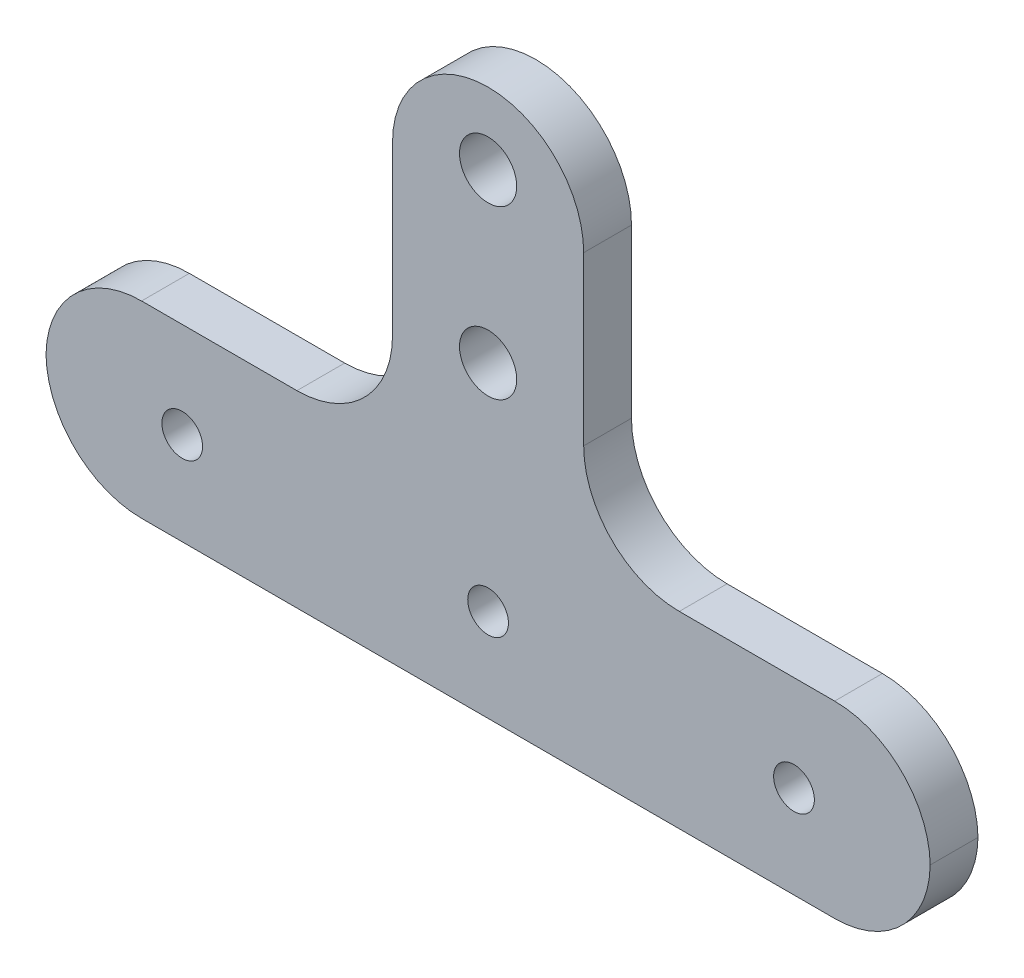
ISO-10303-21;
HEADER;
FILE_DESCRIPTION(('STEP AP214'),'2;1');
FILE_NAME('part.step','',(''),(''),'','','');
FILE_SCHEMA(('AUTOMOTIVE_DESIGN { 1 0 10303 214 1 1 1 1 }'));
ENDSEC;
DATA;
#1=APPLICATION_CONTEXT('core data for automotive mechanical design processes');
#2=APPLICATION_PROTOCOL_DEFINITION('international standard','automotive_design',2000,#1);
#3=PRODUCT_CONTEXT('',#1,'mechanical');
#4=PRODUCT('Part','Part','',(#3));
#5=PRODUCT_RELATED_PRODUCT_CATEGORY('part','',(#4));
#6=PRODUCT_DEFINITION_FORMATION('','',#4);
#7=PRODUCT_DEFINITION_CONTEXT('part definition',#1,'design');
#8=PRODUCT_DEFINITION('design','',#6,#7);
#9=PRODUCT_DEFINITION_SHAPE('','',#8);
#10=(LENGTH_UNIT() NAMED_UNIT(*) SI_UNIT(.MILLI.,.METRE.));
#11=(NAMED_UNIT(*) PLANE_ANGLE_UNIT() SI_UNIT($,.RADIAN.));
#12=(NAMED_UNIT(*) SI_UNIT($,.STERADIAN.) SOLID_ANGLE_UNIT());
#13=UNCERTAINTY_MEASURE_WITH_UNIT(LENGTH_MEASURE(1.E-05),#10,'distance_accuracy_value','');
#14=(GEOMETRIC_REPRESENTATION_CONTEXT(3) GLOBAL_UNCERTAINTY_ASSIGNED_CONTEXT((#13)) GLOBAL_UNIT_ASSIGNED_CONTEXT((#10,
#11,#12)) REPRESENTATION_CONTEXT('',''));
#15=CARTESIAN_POINT('',(0.,0.,0.));
#16=DIRECTION('',(0.,0.,1.));
#17=DIRECTION('',(1.,0.,0.));
#18=AXIS2_PLACEMENT_3D('',#15,#16,#17);
#19=CARTESIAN_POINT('',(0.,100.140279828564,3.175));
#20=DIRECTION('',(0.,1.,0.));
#21=DIRECTION('',(0.,0.,1.));
#22=AXIS2_PLACEMENT_3D('',#19,#20,#21);
#23=PLANE('',#22);
#24=DIRECTION('',(1.,0.,0.));
#25=VECTOR('',#24,1.);
#26=CARTESIAN_POINT('',(0.,100.140279828564,0.));
#27=LINE('',#26,#25);
#28=CARTESIAN_POINT('',(12.7,100.140279828564,0.));
#29=VERTEX_POINT('',#28);
#30=CARTESIAN_POINT('',(23.01875,100.140279828564,0.));
#31=VERTEX_POINT('',#30);
#32=EDGE_CURVE('E166',#29,#31,#27,.T.);
#33=ORIENTED_EDGE('',*,*,#32,.F.);
#34=DIRECTION('',(0.,0.,-1.));
#35=VECTOR('',#34,1.);
#36=CARTESIAN_POINT('',(12.7,100.140279828564,3.175));
#37=LINE('',#36,#35);
#38=CARTESIAN_POINT('',(12.7,100.140279828564,3.175));
#39=VERTEX_POINT('',#38);
#40=EDGE_CURVE('E178',#29,#39,#37,.F.);
#41=ORIENTED_EDGE('',*,*,#40,.T.);
#42=DIRECTION('',(1.,0.,0.));
#43=VECTOR('',#42,1.);
#44=CARTESIAN_POINT('',(0.,100.140279828564,3.175));
#45=LINE('',#44,#43);
#46=CARTESIAN_POINT('',(23.01875,100.140279828564,3.175));
#47=VERTEX_POINT('',#46);
#48=EDGE_CURVE('E151',#39,#47,#45,.T.);
#49=ORIENTED_EDGE('',*,*,#48,.T.);
#50=DIRECTION('',(0.,0.,-1.));
#51=VECTOR('',#50,1.);
#52=CARTESIAN_POINT('',(23.01875,100.140279828564,3.175));
#53=LINE('',#52,#51);
#54=EDGE_CURVE('E176',#47,#31,#53,.T.);
#55=ORIENTED_EDGE('',*,*,#54,.T.);
#56=EDGE_LOOP('',(#33,#41,#49,#55));
#57=FACE_BOUND('',#56,.T.);
#58=ADVANCED_FACE('F36',(#57),#23,.T.);
#59=CARTESIAN_POINT('',(6.3500000000001,-231.141421356237,3.175));
#60=DIRECTION('',(1.,0.,0.));
#61=DIRECTION('',(0.,1.,0.));
#62=AXIS2_PLACEMENT_3D('',#59,#60,#61);
#63=PLANE('',#62);
#64=DIRECTION('',(0.,-1.,0.));
#65=VECTOR('',#64,1.);
#66=CARTESIAN_POINT('',(6.3500000000001,-231.141421356237,3.175));
#67=LINE('',#66,#65);
#68=CARTESIAN_POINT('',(6.35,117.602779828564,3.175));
#69=VERTEX_POINT('',#68);
#70=CARTESIAN_POINT('',(6.35,106.490279828564,3.175));
#71=VERTEX_POINT('',#70);
#72=EDGE_CURVE('E130',#69,#71,#67,.T.);
#73=ORIENTED_EDGE('',*,*,#72,.T.);
#74=DIRECTION('',(0.,0.,-1.));
#75=VECTOR('',#74,1.);
#76=CARTESIAN_POINT('',(6.35,106.490279828564,0.));
#77=LINE('',#76,#75);
#78=CARTESIAN_POINT('',(6.35,106.490279828564,0.));
#79=VERTEX_POINT('',#78);
#80=EDGE_CURVE('E136',#71,#79,#77,.T.);
#81=ORIENTED_EDGE('',*,*,#80,.T.);
#82=DIRECTION('',(0.,-1.,0.));
#83=VECTOR('',#82,1.);
#84=CARTESIAN_POINT('',(6.3500000000001,-231.141421356237,0.));
#85=LINE('',#84,#83);
#86=CARTESIAN_POINT('',(6.35,117.602779828564,0.));
#87=VERTEX_POINT('',#86);
#88=EDGE_CURVE('E133',#87,#79,#85,.T.);
#89=ORIENTED_EDGE('',*,*,#88,.F.);
#90=DIRECTION('',(0.,0.,-1.));
#91=VECTOR('',#90,1.);
#92=CARTESIAN_POINT('',(6.35,117.602779828564,3.175));
#93=LINE('',#92,#91);
#94=EDGE_CURVE('E125',#69,#87,#93,.T.);
#95=ORIENTED_EDGE('',*,*,#94,.F.);
#96=EDGE_LOOP('',(#73,#81,#89,#95));
#97=FACE_BOUND('',#96,.T.);
#98=ADVANCED_FACE('F127',(#97),#63,.T.);
#99=CARTESIAN_POINT('',(0.,117.602779828564,3.175));
#100=DIRECTION('',(0.,0.,-1.));
#101=DIRECTION('',(-1.,0.,0.));
#102=AXIS2_PLACEMENT_3D('',#99,#100,#101);
#103=CYLINDRICAL_SURFACE('',#102,6.35);
#104=CARTESIAN_POINT('',(0.,117.602779828564,0.));
#105=DIRECTION('',(0.,0.,1.));
#106=DIRECTION('',(1.,0.,0.));
#107=AXIS2_PLACEMENT_3D('',#104,#105,#106);
#108=CIRCLE('',#107,6.35);
#109=CARTESIAN_POINT('',(-6.35,117.602779828564,0.));
#110=VERTEX_POINT('',#109);
#111=EDGE_CURVE('E168',#87,#110,#108,.T.);
#112=ORIENTED_EDGE('',*,*,#111,.T.);
#113=DIRECTION('',(0.,0.,-1.));
#114=VECTOR('',#113,1.);
#115=CARTESIAN_POINT('',(-6.35,117.602779828564,3.175));
#116=LINE('',#115,#114);
#117=CARTESIAN_POINT('',(-6.35,117.602779828564,3.175));
#118=VERTEX_POINT('',#117);
#119=EDGE_CURVE('E137',#118,#110,#116,.T.);
#120=ORIENTED_EDGE('',*,*,#119,.F.);
#121=CARTESIAN_POINT('',(0.,117.602779828564,3.175));
#122=DIRECTION('',(0.,0.,1.));
#123=DIRECTION('',(1.,0.,0.));
#124=AXIS2_PLACEMENT_3D('',#121,#122,#123);
#125=CIRCLE('',#124,6.35);
#126=EDGE_CURVE('E140',#69,#118,#125,.T.);
#127=ORIENTED_EDGE('',*,*,#126,.F.);
#128=ORIENTED_EDGE('',*,*,#94,.T.);
#129=EDGE_LOOP('',(#112,#120,#127,#128));
#130=FACE_BOUND('',#129,.T.);
#131=ADVANCED_FACE('F141',(#130),#103,.T.);
#132=CARTESIAN_POINT('',(-6.35000000000003,-231.141421356237,3.175));
#133=DIRECTION('',(1.,0.,0.));
#134=DIRECTION('',(0.,1.,0.));
#135=AXIS2_PLACEMENT_3D('',#132,#133,#134);
#136=PLANE('',#135);
#137=DIRECTION('',(0.,-1.,0.));
#138=VECTOR('',#137,1.);
#139=CARTESIAN_POINT('',(-6.35000000000003,-231.141421356237,0.));
#140=LINE('',#139,#138);
#141=CARTESIAN_POINT('',(-6.35,106.490279828564,0.));
#142=VERTEX_POINT('',#141);
#143=EDGE_CURVE('E165',#110,#142,#140,.T.);
#144=ORIENTED_EDGE('',*,*,#143,.T.);
#145=DIRECTION('',(0.,0.,-1.));
#146=VECTOR('',#145,1.);
#147=CARTESIAN_POINT('',(-6.35,106.490279828564,3.175));
#148=LINE('',#147,#146);
#149=CARTESIAN_POINT('',(-6.35,106.490279828564,3.175));
#150=VERTEX_POINT('',#149);
#151=EDGE_CURVE('E186',#142,#150,#148,.F.);
#152=ORIENTED_EDGE('',*,*,#151,.T.);
#153=DIRECTION('',(0.,-1.,0.));
#154=VECTOR('',#153,1.);
#155=CARTESIAN_POINT('',(-6.35000000000003,-231.141421356237,3.175));
#156=LINE('',#155,#154);
#157=EDGE_CURVE('E145',#118,#150,#156,.T.);
#158=ORIENTED_EDGE('',*,*,#157,.F.);
#159=ORIENTED_EDGE('',*,*,#119,.T.);
#160=EDGE_LOOP('',(#144,#152,#158,#159));
#161=FACE_BOUND('',#160,.T.);
#162=ADVANCED_FACE('F309',(#161),#136,.F.);
#163=CARTESIAN_POINT('',(-23.01875,100.140279828564,3.175));
#164=VERTEX_POINT('',#163);
#165=CARTESIAN_POINT('',(-12.7,100.140279828564,3.175));
#166=VERTEX_POINT('',#165);
#167=EDGE_CURVE('E156',#164,#166,#45,.T.);
#168=ORIENTED_EDGE('',*,*,#167,.T.);
#169=DIRECTION('',(0.,0.,-1.));
#170=VECTOR('',#169,1.);
#171=CARTESIAN_POINT('',(-12.7,100.140279828564,3.175));
#172=LINE('',#171,#170);
#173=CARTESIAN_POINT('',(-12.7,100.140279828564,0.));
#174=VERTEX_POINT('',#173);
#175=EDGE_CURVE('E183',#166,#174,#172,.T.);
#176=ORIENTED_EDGE('',*,*,#175,.T.);
#177=CARTESIAN_POINT('',(-23.01875,100.140279828564,0.));
#178=VERTEX_POINT('',#177);
#179=EDGE_CURVE('E162',#178,#174,#27,.T.);
#180=ORIENTED_EDGE('',*,*,#179,.F.);
#181=DIRECTION('',(0.,0.,-1.));
#182=VECTOR('',#181,1.);
#183=CARTESIAN_POINT('',(-23.01875,100.140279828564,3.175));
#184=LINE('',#183,#182);
#185=EDGE_CURVE('E180',#178,#164,#184,.F.);
#186=ORIENTED_EDGE('',*,*,#185,.T.);
#187=EDGE_LOOP('',(#168,#176,#180,#186));
#188=FACE_BOUND('',#187,.T.);
#189=ADVANCED_FACE('F286',(#188),#23,.T.);
#190=CARTESIAN_POINT('',(0.,87.6332261423153,3.175));
#191=DIRECTION('',(0.,1.,0.));
#192=DIRECTION('',(0.,0.,1.));
#193=AXIS2_PLACEMENT_3D('',#190,#191,#192);
#194=PLANE('',#193);
#195=DIRECTION('',(1.,0.,0.));
#196=VECTOR('',#195,1.);
#197=CARTESIAN_POINT('',(0.,87.6332261423153,0.));
#198=LINE('',#197,#196);
#199=CARTESIAN_POINT('',(-23.01875,87.6332261423153,0.));
#200=VERTEX_POINT('',#199);
#201=CARTESIAN_POINT('',(23.01875,87.6332261423153,0.));
#202=VERTEX_POINT('',#201);
#203=EDGE_CURVE('E154',#200,#202,#198,.T.);
#204=ORIENTED_EDGE('',*,*,#203,.T.);
#205=DIRECTION('',(0.,0.,-1.));
#206=VECTOR('',#205,1.);
#207=CARTESIAN_POINT('',(23.01875,87.6332261423153,3.175));
#208=LINE('',#207,#206);
#209=CARTESIAN_POINT('',(23.01875,87.6332261423153,3.175));
#210=VERTEX_POINT('',#209);
#211=EDGE_CURVE('E198',#202,#210,#208,.F.);
#212=ORIENTED_EDGE('',*,*,#211,.T.);
#213=DIRECTION('',(1.,0.,0.));
#214=VECTOR('',#213,1.);
#215=CARTESIAN_POINT('',(0.,87.6332261423153,3.175));
#216=LINE('',#215,#214);
#217=CARTESIAN_POINT('',(-23.01875,87.6332261423153,3.175));
#218=VERTEX_POINT('',#217);
#219=EDGE_CURVE('E160',#218,#210,#216,.T.);
#220=ORIENTED_EDGE('',*,*,#219,.F.);
#221=DIRECTION('',(0.,0.,-1.));
#222=VECTOR('',#221,1.);
#223=CARTESIAN_POINT('',(-23.01875,87.6332261423153,3.175));
#224=LINE('',#223,#222);
#225=EDGE_CURVE('E196',#218,#200,#224,.T.);
#226=ORIENTED_EDGE('',*,*,#225,.T.);
#227=EDGE_LOOP('',(#204,#212,#220,#226));
#228=FACE_BOUND('',#227,.T.);
#229=ADVANCED_FACE('F278',(#228),#194,.F.);
#230=CARTESIAN_POINT('',(0.,-231.141421356237,3.175));
#231=DIRECTION('',(0.,0.,1.));
#232=DIRECTION('',(1.,0.,0.));
#233=AXIS2_PLACEMENT_3D('',#230,#231,#232);
#234=PLANE('',#233);
#235=CARTESIAN_POINT('',(0.,119.190279828564,3.175));
#236=DIRECTION('',(0.,0.,-1.));
#237=DIRECTION('',(-1.,0.,0.));
#238=AXIS2_PLACEMENT_3D('',#235,#236,#237);
#239=CIRCLE('',#238,1.89865);
#240=CARTESIAN_POINT('',(-1.89864999999999,119.190279828564,3.175));
#241=VERTEX_POINT('',#240);
#242=EDGE_CURVE('E246',#241,#241,#239,.T.);
#243=ORIENTED_EDGE('',*,*,#242,.T.);
#244=EDGE_LOOP('',(#243));
#245=FACE_BOUND('',#244,.T.);
#246=CARTESIAN_POINT('',(0.,108.077779828564,3.175));
#247=DIRECTION('',(0.,0.,-1.));
#248=DIRECTION('',(-1.,0.,0.));
#249=AXIS2_PLACEMENT_3D('',#246,#247,#248);
#250=CIRCLE('',#249,1.89865);
#251=CARTESIAN_POINT('',(-1.89864999999999,108.077779828564,3.175));
#252=VERTEX_POINT('',#251);
#253=EDGE_CURVE('E240',#252,#252,#250,.T.);
#254=ORIENTED_EDGE('',*,*,#253,.T.);
#255=EDGE_LOOP('',(#254));
#256=FACE_BOUND('',#255,.T.);
#257=CARTESIAN_POINT('',(20.32,93.7902798285639,3.175));
#258=DIRECTION('',(0.,0.,-1.));
#259=DIRECTION('',(-1.,0.,0.));
#260=AXIS2_PLACEMENT_3D('',#257,#258,#259);
#261=CIRCLE('',#260,1.35254999999999);
#262=CARTESIAN_POINT('',(18.96745,93.7902798285639,3.175));
#263=VERTEX_POINT('',#262);
#264=EDGE_CURVE('E234',#263,#263,#261,.T.);
#265=ORIENTED_EDGE('',*,*,#264,.T.);
#266=EDGE_LOOP('',(#265));
#267=FACE_BOUND('',#266,.T.);
#268=CARTESIAN_POINT('',(0.,93.7902798285639,3.175));
#269=DIRECTION('',(0.,0.,-1.));
#270=DIRECTION('',(-1.,0.,0.));
#271=AXIS2_PLACEMENT_3D('',#268,#269,#270);
#272=CIRCLE('',#271,1.35254999999999);
#273=CARTESIAN_POINT('',(-1.35254999999999,93.7902798285639,3.175));
#274=VERTEX_POINT('',#273);
#275=EDGE_CURVE('E226',#274,#274,#272,.T.);
#276=ORIENTED_EDGE('',*,*,#275,.T.);
#277=EDGE_LOOP('',(#276));
#278=FACE_BOUND('',#277,.T.);
#279=CARTESIAN_POINT('',(-20.32,93.7902798285639,3.175));
#280=DIRECTION('',(0.,0.,-1.));
#281=DIRECTION('',(-1.,0.,0.));
#282=AXIS2_PLACEMENT_3D('',#279,#280,#281);
#283=CIRCLE('',#282,1.35254999999999);
#284=CARTESIAN_POINT('',(-21.67255,93.7902798285639,3.175));
#285=VERTEX_POINT('',#284);
#286=EDGE_CURVE('E217',#285,#285,#283,.T.);
#287=ORIENTED_EDGE('',*,*,#286,.T.);
#288=EDGE_LOOP('',(#287));
#289=FACE_BOUND('',#288,.T.);
#290=ORIENTED_EDGE('',*,*,#219,.T.);
#291=CARTESIAN_POINT('',(23.01875,93.9832261423152,3.175));
#292=DIRECTION('',(0.,0.,1.));
#293=DIRECTION('',(1.,0.,0.));
#294=AXIS2_PLACEMENT_3D('',#291,#292,#293);
#295=CIRCLE('',#294,6.35);
#296=CARTESIAN_POINT('',(29.3680171175501,93.8867529854395,3.175));
#297=VERTEX_POINT('',#296);
#298=EDGE_CURVE('E53',#210,#297,#295,.T.);
#299=ORIENTED_EDGE('',*,*,#298,.T.);
#300=CARTESIAN_POINT('',(23.01875,93.7902798285638,3.175));
#301=DIRECTION('',(0.,0.,1.));
#302=DIRECTION('',(1.,0.,0.));
#303=AXIS2_PLACEMENT_3D('',#300,#301,#302);
#304=CIRCLE('',#303,6.35);
#305=EDGE_CURVE('E204',#297,#47,#304,.T.);
#306=ORIENTED_EDGE('',*,*,#305,.T.);
#307=ORIENTED_EDGE('',*,*,#48,.F.);
#308=CARTESIAN_POINT('',(12.7,106.490279828564,3.175));
#309=DIRECTION('',(0.,0.,1.));
#310=DIRECTION('',(1.,0.,0.));
#311=AXIS2_PLACEMENT_3D('',#308,#309,#310);
#312=CIRCLE('',#311,6.35);
#313=EDGE_CURVE('E150',#39,#71,#312,.F.);
#314=ORIENTED_EDGE('',*,*,#313,.T.);
#315=ORIENTED_EDGE('',*,*,#72,.F.);
#316=ORIENTED_EDGE('',*,*,#126,.T.);
#317=ORIENTED_EDGE('',*,*,#157,.T.);
#318=CARTESIAN_POINT('',(-12.7,106.490279828564,3.175));
#319=DIRECTION('',(0.,0.,1.));
#320=DIRECTION('',(1.,0.,0.));
#321=AXIS2_PLACEMENT_3D('',#318,#319,#320);
#322=CIRCLE('',#321,6.35);
#323=EDGE_CURVE('E11',#150,#166,#322,.F.);
#324=ORIENTED_EDGE('',*,*,#323,.T.);
#325=ORIENTED_EDGE('',*,*,#167,.F.);
#326=CARTESIAN_POINT('',(-23.01875,93.7902798285638,3.175));
#327=DIRECTION('',(0.,0.,1.));
#328=DIRECTION('',(1.,0.,0.));
#329=AXIS2_PLACEMENT_3D('',#326,#327,#328);
#330=CIRCLE('',#329,6.35);
#331=CARTESIAN_POINT('',(-29.3680171175501,93.8867529854395,3.175));
#332=VERTEX_POINT('',#331);
#333=EDGE_CURVE('E60',#164,#332,#330,.T.);
#334=ORIENTED_EDGE('',*,*,#333,.T.);
#335=CARTESIAN_POINT('',(-23.01875,93.9832261423153,3.175));
#336=DIRECTION('',(0.,0.,1.));
#337=DIRECTION('',(1.,0.,0.));
#338=AXIS2_PLACEMENT_3D('',#335,#336,#337);
#339=CIRCLE('',#338,6.35);
#340=EDGE_CURVE('E201',#332,#218,#339,.T.);
#341=ORIENTED_EDGE('',*,*,#340,.T.);
#342=EDGE_LOOP('',(#290,#299,#306,#307,#314,#315,#316,#317,#324,#325,#334,#341));
#343=FACE_BOUND('',#342,.T.);
#344=ADVANCED_FACE('F147',(#245,#256,#267,#278,#289,#343),#234,.T.);
#345=CARTESIAN_POINT('',(0.,-231.141421356237,0.));
#346=DIRECTION('',(0.,0.,1.));
#347=DIRECTION('',(1.,0.,0.));
#348=AXIS2_PLACEMENT_3D('',#345,#346,#347);
#349=PLANE('',#348);
#350=CARTESIAN_POINT('',(0.,119.190279828564,0.));
#351=DIRECTION('',(0.,0.,-1.));
#352=DIRECTION('',(-1.,0.,0.));
#353=AXIS2_PLACEMENT_3D('',#350,#351,#352);
#354=CIRCLE('',#353,1.89864999999999);
#355=CARTESIAN_POINT('',(-1.89864999999998,119.190279828564,0.));
#356=VERTEX_POINT('',#355);
#357=EDGE_CURVE('E249',#356,#356,#354,.T.);
#358=ORIENTED_EDGE('',*,*,#357,.F.);
#359=EDGE_LOOP('',(#358));
#360=FACE_BOUND('',#359,.T.);
#361=CARTESIAN_POINT('',(0.,108.077779828564,0.));
#362=DIRECTION('',(0.,0.,-1.));
#363=DIRECTION('',(-1.,0.,0.));
#364=AXIS2_PLACEMENT_3D('',#361,#362,#363);
#365=CIRCLE('',#364,1.89864999999999);
#366=CARTESIAN_POINT('',(-1.89864999999998,108.077779828564,0.));
#367=VERTEX_POINT('',#366);
#368=EDGE_CURVE('E243',#367,#367,#365,.T.);
#369=ORIENTED_EDGE('',*,*,#368,.F.);
#370=EDGE_LOOP('',(#369));
#371=FACE_BOUND('',#370,.T.);
#372=CARTESIAN_POINT('',(20.32,93.7902798285639,0.));
#373=DIRECTION('',(0.,0.,-1.));
#374=DIRECTION('',(-1.,0.,0.));
#375=AXIS2_PLACEMENT_3D('',#372,#373,#374);
#376=CIRCLE('',#375,1.35254999999999);
#377=CARTESIAN_POINT('',(18.96745,93.7902798285639,0.));
#378=VERTEX_POINT('',#377);
#379=EDGE_CURVE('E237',#378,#378,#376,.T.);
#380=ORIENTED_EDGE('',*,*,#379,.F.);
#381=EDGE_LOOP('',(#380));
#382=FACE_BOUND('',#381,.T.);
#383=CARTESIAN_POINT('',(0.,93.7902798285639,0.));
#384=DIRECTION('',(0.,0.,-1.));
#385=DIRECTION('',(-1.,0.,0.));
#386=AXIS2_PLACEMENT_3D('',#383,#384,#385);
#387=CIRCLE('',#386,1.35254999999999);
#388=CARTESIAN_POINT('',(-1.35254999999999,93.7902798285639,0.));
#389=VERTEX_POINT('',#388);
#390=EDGE_CURVE('E231',#389,#389,#387,.T.);
#391=ORIENTED_EDGE('',*,*,#390,.F.);
#392=EDGE_LOOP('',(#391));
#393=FACE_BOUND('',#392,.T.);
#394=CARTESIAN_POINT('',(-20.32,93.7902798285639,0.));
#395=DIRECTION('',(0.,0.,-1.));
#396=DIRECTION('',(-1.,0.,0.));
#397=AXIS2_PLACEMENT_3D('',#394,#395,#396);
#398=CIRCLE('',#397,1.35254999999999);
#399=CARTESIAN_POINT('',(-21.67255,93.7902798285639,0.));
#400=VERTEX_POINT('',#399);
#401=EDGE_CURVE('E222',#400,#400,#398,.T.);
#402=ORIENTED_EDGE('',*,*,#401,.F.);
#403=EDGE_LOOP('',(#402));
#404=FACE_BOUND('',#403,.T.);
#405=CARTESIAN_POINT('',(23.01875,93.7902798285638,0.));
#406=DIRECTION('',(0.,0.,1.));
#407=DIRECTION('',(1.,0.,0.));
#408=AXIS2_PLACEMENT_3D('',#405,#406,#407);
#409=CIRCLE('',#408,6.35);
#410=CARTESIAN_POINT('',(29.3680171175501,93.8867529854395,0.));
#411=VERTEX_POINT('',#410);
#412=EDGE_CURVE('E192',#31,#411,#409,.F.);
#413=ORIENTED_EDGE('',*,*,#412,.T.);
#414=CARTESIAN_POINT('',(23.01875,93.9832261423152,0.));
#415=DIRECTION('',(0.,0.,1.));
#416=DIRECTION('',(1.,0.,0.));
#417=AXIS2_PLACEMENT_3D('',#414,#415,#416);
#418=CIRCLE('',#417,6.35);
#419=EDGE_CURVE('E194',#411,#202,#418,.F.);
#420=ORIENTED_EDGE('',*,*,#419,.T.);
#421=ORIENTED_EDGE('',*,*,#203,.F.);
#422=CARTESIAN_POINT('',(-23.01875,93.9832261423153,0.));
#423=DIRECTION('',(0.,0.,1.));
#424=DIRECTION('',(1.,0.,0.));
#425=AXIS2_PLACEMENT_3D('',#422,#423,#424);
#426=CIRCLE('',#425,6.35);
#427=CARTESIAN_POINT('',(-29.3680171175501,93.8867529854395,0.));
#428=VERTEX_POINT('',#427);
#429=EDGE_CURVE('E188',#200,#428,#426,.F.);
#430=ORIENTED_EDGE('',*,*,#429,.T.);
#431=CARTESIAN_POINT('',(-23.01875,93.7902798285638,0.));
#432=DIRECTION('',(0.,0.,1.));
#433=DIRECTION('',(1.,0.,0.));
#434=AXIS2_PLACEMENT_3D('',#431,#432,#433);
#435=CIRCLE('',#434,6.35);
#436=EDGE_CURVE('E190',#428,#178,#435,.F.);
#437=ORIENTED_EDGE('',*,*,#436,.T.);
#438=ORIENTED_EDGE('',*,*,#179,.T.);
#439=CARTESIAN_POINT('',(-12.7,106.490279828564,0.));
#440=DIRECTION('',(0.,0.,1.));
#441=DIRECTION('',(1.,0.,0.));
#442=AXIS2_PLACEMENT_3D('',#439,#440,#441);
#443=CIRCLE('',#442,6.35);
#444=EDGE_CURVE('E45',#174,#142,#443,.T.);
#445=ORIENTED_EDGE('',*,*,#444,.T.);
#446=ORIENTED_EDGE('',*,*,#143,.F.);
#447=ORIENTED_EDGE('',*,*,#111,.F.);
#448=ORIENTED_EDGE('',*,*,#88,.T.);
#449=CARTESIAN_POINT('',(12.7,106.490279828564,0.));
#450=DIRECTION('',(0.,0.,1.));
#451=DIRECTION('',(1.,0.,0.));
#452=AXIS2_PLACEMENT_3D('',#449,#450,#451);
#453=CIRCLE('',#452,6.35);
#454=EDGE_CURVE('E207',#79,#29,#453,.T.);
#455=ORIENTED_EDGE('',*,*,#454,.T.);
#456=ORIENTED_EDGE('',*,*,#32,.T.);
#457=EDGE_LOOP('',(#413,#420,#421,#430,#437,#438,#445,#446,#447,#448,#455,#456));
#458=FACE_BOUND('',#457,.T.);
#459=ADVANCED_FACE('F255',(#360,#371,#382,#393,#404,#458),#349,.F.);
#460=CARTESIAN_POINT('',(12.7,106.490279828564,3.175));
#461=DIRECTION('',(0.,0.,1.));
#462=DIRECTION('',(1.,0.,0.));
#463=AXIS2_PLACEMENT_3D('',#460,#461,#462);
#464=CYLINDRICAL_SURFACE('',#463,6.35);
#465=ORIENTED_EDGE('',*,*,#313,.F.);
#466=ORIENTED_EDGE('',*,*,#40,.F.);
#467=ORIENTED_EDGE('',*,*,#454,.F.);
#468=ORIENTED_EDGE('',*,*,#80,.F.);
#469=EDGE_LOOP('',(#465,#466,#467,#468));
#470=FACE_BOUND('',#469,.T.);
#471=ADVANCED_FACE('F258',(#470),#464,.F.);
#472=CARTESIAN_POINT('',(-12.7,106.490279828564,3.175));
#473=DIRECTION('',(0.,0.,-1.));
#474=DIRECTION('',(-1.,0.,0.));
#475=AXIS2_PLACEMENT_3D('',#472,#473,#474);
#476=CYLINDRICAL_SURFACE('',#475,6.35);
#477=ORIENTED_EDGE('',*,*,#323,.F.);
#478=ORIENTED_EDGE('',*,*,#151,.F.);
#479=ORIENTED_EDGE('',*,*,#444,.F.);
#480=ORIENTED_EDGE('',*,*,#175,.F.);
#481=EDGE_LOOP('',(#477,#478,#479,#480));
#482=FACE_BOUND('',#481,.T.);
#483=ADVANCED_FACE('F322',(#482),#476,.F.);
#484=CARTESIAN_POINT('',(23.01875,93.7902798285638,3.175));
#485=DIRECTION('',(0.,0.,-1.));
#486=DIRECTION('',(-1.,0.,0.));
#487=AXIS2_PLACEMENT_3D('',#484,#485,#486);
#488=CYLINDRICAL_SURFACE('',#487,6.35);
#489=ORIENTED_EDGE('',*,*,#54,.F.);
#490=ORIENTED_EDGE('',*,*,#305,.F.);
#491=DIRECTION('',(0.,0.,-1.));
#492=VECTOR('',#491,1.);
#493=CARTESIAN_POINT('',(29.3680171175501,93.8867529854395,1.5875));
#494=LINE('',#493,#492);
#495=EDGE_CURVE('E210',#411,#297,#494,.F.);
#496=ORIENTED_EDGE('',*,*,#495,.F.);
#497=ORIENTED_EDGE('',*,*,#412,.F.);
#498=EDGE_LOOP('',(#489,#490,#496,#497));
#499=FACE_BOUND('',#498,.T.);
#500=ADVANCED_FACE('F273',(#499),#488,.T.);
#501=CARTESIAN_POINT('',(23.01875,93.9832261423152,3.175));
#502=DIRECTION('',(0.,0.,1.));
#503=DIRECTION('',(1.,0.,0.));
#504=AXIS2_PLACEMENT_3D('',#501,#502,#503);
#505=CYLINDRICAL_SURFACE('',#504,6.35);
#506=ORIENTED_EDGE('',*,*,#298,.F.);
#507=ORIENTED_EDGE('',*,*,#211,.F.);
#508=ORIENTED_EDGE('',*,*,#419,.F.);
#509=ORIENTED_EDGE('',*,*,#495,.T.);
#510=EDGE_LOOP('',(#506,#507,#508,#509));
#511=FACE_BOUND('',#510,.T.);
#512=ADVANCED_FACE('F275',(#511),#505,.T.);
#513=CARTESIAN_POINT('',(-23.01875,93.9832261423153,3.175));
#514=DIRECTION('',(0.,0.,-1.));
#515=DIRECTION('',(-1.,0.,0.));
#516=AXIS2_PLACEMENT_3D('',#513,#514,#515);
#517=CYLINDRICAL_SURFACE('',#516,6.35);
#518=ORIENTED_EDGE('',*,*,#225,.F.);
#519=ORIENTED_EDGE('',*,*,#340,.F.);
#520=DIRECTION('',(0.,0.,-1.));
#521=VECTOR('',#520,1.);
#522=CARTESIAN_POINT('',(-29.3680171175501,93.8867529854395,1.5875));
#523=LINE('',#522,#521);
#524=EDGE_CURVE('E40',#428,#332,#523,.F.);
#525=ORIENTED_EDGE('',*,*,#524,.F.);
#526=ORIENTED_EDGE('',*,*,#429,.F.);
#527=EDGE_LOOP('',(#518,#519,#525,#526));
#528=FACE_BOUND('',#527,.T.);
#529=ADVANCED_FACE('F38',(#528),#517,.T.);
#530=CARTESIAN_POINT('',(-23.01875,93.7902798285638,3.175));
#531=DIRECTION('',(0.,0.,1.));
#532=DIRECTION('',(1.,0.,0.));
#533=AXIS2_PLACEMENT_3D('',#530,#531,#532);
#534=CYLINDRICAL_SURFACE('',#533,6.35);
#535=ORIENTED_EDGE('',*,*,#333,.F.);
#536=ORIENTED_EDGE('',*,*,#185,.F.);
#537=ORIENTED_EDGE('',*,*,#436,.F.);
#538=ORIENTED_EDGE('',*,*,#524,.T.);
#539=EDGE_LOOP('',(#535,#536,#537,#538));
#540=FACE_BOUND('',#539,.T.);
#541=ADVANCED_FACE('F288',(#540),#534,.T.);
#542=CARTESIAN_POINT('',(-20.32,93.7902798285639,0.));
#543=DIRECTION('',(0.,0.,-1.));
#544=DIRECTION('',(-1.,0.,0.));
#545=AXIS2_PLACEMENT_3D('',#542,#543,#544);
#546=CYLINDRICAL_SURFACE('',#545,1.35254999999999);
#547=ORIENTED_EDGE('',*,*,#286,.F.);
#548=EDGE_LOOP('',(#547));
#549=FACE_BOUND('',#548,.T.);
#550=ORIENTED_EDGE('',*,*,#401,.T.);
#551=EDGE_LOOP('',(#550));
#552=FACE_BOUND('',#551,.T.);
#553=ADVANCED_FACE('F290',(#549,#552),#546,.F.);
#554=CARTESIAN_POINT('',(0.,93.7902798285639,0.));
#555=DIRECTION('',(0.,0.,-1.));
#556=DIRECTION('',(-1.,0.,0.));
#557=AXIS2_PLACEMENT_3D('',#554,#555,#556);
#558=CYLINDRICAL_SURFACE('',#557,1.35254999999999);
#559=ORIENTED_EDGE('',*,*,#275,.F.);
#560=EDGE_LOOP('',(#559));
#561=FACE_BOUND('',#560,.T.);
#562=ORIENTED_EDGE('',*,*,#390,.T.);
#563=EDGE_LOOP('',(#562));
#564=FACE_BOUND('',#563,.T.);
#565=ADVANCED_FACE('F295',(#561,#564),#558,.F.);
#566=CARTESIAN_POINT('',(20.32,93.7902798285639,0.));
#567=DIRECTION('',(0.,0.,-1.));
#568=DIRECTION('',(-1.,0.,0.));
#569=AXIS2_PLACEMENT_3D('',#566,#567,#568);
#570=CYLINDRICAL_SURFACE('',#569,1.35254999999999);
#571=ORIENTED_EDGE('',*,*,#264,.F.);
#572=EDGE_LOOP('',(#571));
#573=FACE_BOUND('',#572,.T.);
#574=ORIENTED_EDGE('',*,*,#379,.T.);
#575=EDGE_LOOP('',(#574));
#576=FACE_BOUND('',#575,.T.);
#577=ADVANCED_FACE('F362',(#573,#576),#570,.F.);
#578=CARTESIAN_POINT('',(0.,108.077779828564,0.));
#579=DIRECTION('',(0.,0.,-1.));
#580=DIRECTION('',(-1.,0.,0.));
#581=AXIS2_PLACEMENT_3D('',#578,#579,#580);
#582=CYLINDRICAL_SURFACE('',#581,1.89864999999999);
#583=ORIENTED_EDGE('',*,*,#253,.F.);
#584=EDGE_LOOP('',(#583));
#585=FACE_BOUND('',#584,.T.);
#586=ORIENTED_EDGE('',*,*,#368,.T.);
#587=EDGE_LOOP('',(#586));
#588=FACE_BOUND('',#587,.T.);
#589=ADVANCED_FACE('F373',(#585,#588),#582,.F.);
#590=CARTESIAN_POINT('',(0.,119.190279828564,0.));
#591=DIRECTION('',(0.,0.,-1.));
#592=DIRECTION('',(-1.,0.,0.));
#593=AXIS2_PLACEMENT_3D('',#590,#591,#592);
#594=CYLINDRICAL_SURFACE('',#593,1.89864999999999);
#595=ORIENTED_EDGE('',*,*,#242,.F.);
#596=EDGE_LOOP('',(#595));
#597=FACE_BOUND('',#596,.T.);
#598=ORIENTED_EDGE('',*,*,#357,.T.);
#599=EDGE_LOOP('',(#598));
#600=FACE_BOUND('',#599,.T.);
#601=ADVANCED_FACE('F253',(#597,#600),#594,.F.);
#602=CLOSED_SHELL('',(#58,#98,#131,#162,#189,#229,#344,#459,#471,#483,#500,#512,#529,#541,#553,
#565,#577,#589,#601));
#603=MANIFOLD_SOLID_BREP('B2',#602);
#604=ADVANCED_BREP_SHAPE_REPRESENTATION('',(#18,#603),#14);
#605=SHAPE_DEFINITION_REPRESENTATION(#9,#604);
ENDSEC;
END-ISO-10303-21;
